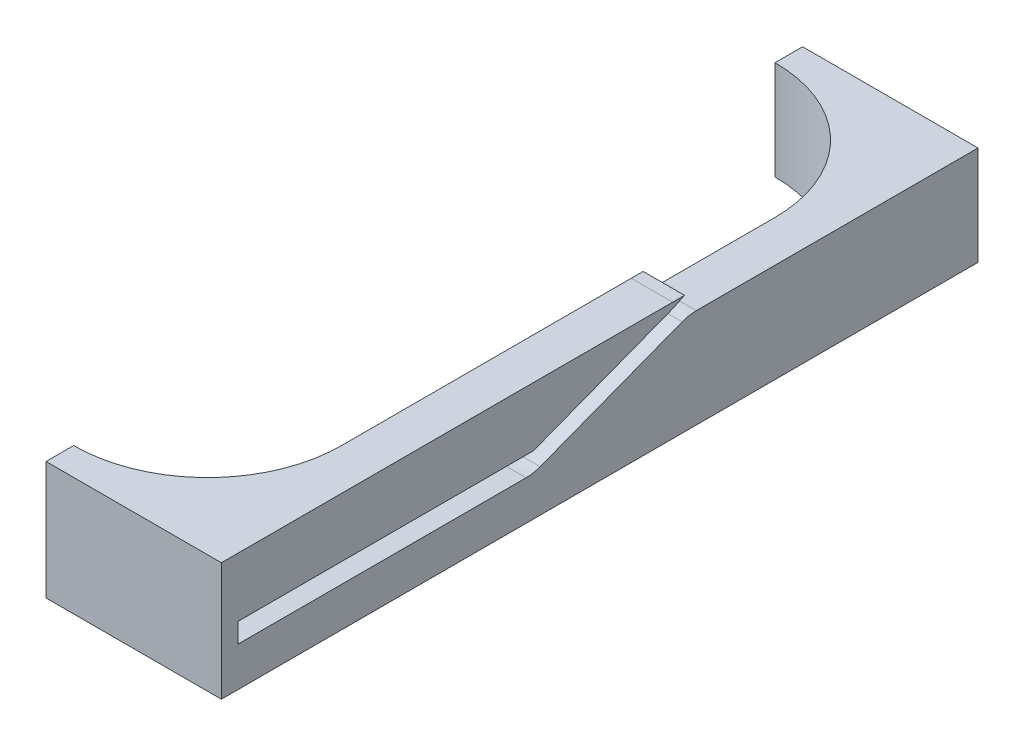
ISO-10303-21;
HEADER;
FILE_DESCRIPTION(('STEP AP214'),'2;1');
FILE_NAME('part.step','',(''),(''),'','','');
FILE_SCHEMA(('AUTOMOTIVE_DESIGN { 1 0 10303 214 1 1 1 1 }'));
ENDSEC;
DATA;
#1=APPLICATION_CONTEXT('core data for automotive mechanical design processes');
#2=APPLICATION_PROTOCOL_DEFINITION('international standard','automotive_design',2000,#1);
#3=PRODUCT_CONTEXT('',#1,'mechanical');
#4=PRODUCT('Part','Part','',(#3));
#5=PRODUCT_RELATED_PRODUCT_CATEGORY('part','',(#4));
#6=PRODUCT_DEFINITION_FORMATION('','',#4);
#7=PRODUCT_DEFINITION_CONTEXT('part definition',#1,'design');
#8=PRODUCT_DEFINITION('design','',#6,#7);
#9=PRODUCT_DEFINITION_SHAPE('','',#8);
#10=(LENGTH_UNIT() NAMED_UNIT(*) SI_UNIT(.MILLI.,.METRE.));
#11=(NAMED_UNIT(*) PLANE_ANGLE_UNIT() SI_UNIT($,.RADIAN.));
#12=(NAMED_UNIT(*) SI_UNIT($,.STERADIAN.) SOLID_ANGLE_UNIT());
#13=UNCERTAINTY_MEASURE_WITH_UNIT(LENGTH_MEASURE(1.E-05),#10,'distance_accuracy_value','');
#14=(GEOMETRIC_REPRESENTATION_CONTEXT(3) GLOBAL_UNCERTAINTY_ASSIGNED_CONTEXT((#13)) GLOBAL_UNIT_ASSIGNED_CONTEXT((#10,
#11,#12)) REPRESENTATION_CONTEXT('',''));
#15=CARTESIAN_POINT('',(0.,0.,0.));
#16=DIRECTION('',(0.,0.,1.));
#17=DIRECTION('',(1.,0.,0.));
#18=AXIS2_PLACEMENT_3D('',#15,#16,#17);
#19=CARTESIAN_POINT('',(23.5,30.,34.9563310678291));
#20=DIRECTION('',(-1.,0.,0.));
#21=DIRECTION('',(0.,0.,1.));
#22=AXIS2_PLACEMENT_3D('',#19,#20,#21);
#23=PLANE('',#22);
#24=DIRECTION('',(0.,0.,-1.));
#25=VECTOR('',#24,1.);
#26=CARTESIAN_POINT('',(23.5,30.,34.9563310678291));
#27=LINE('',#26,#25);
#28=CARTESIAN_POINT('',(23.5,30.,34.9563310678291));
#29=VERTEX_POINT('',#28);
#30=CARTESIAN_POINT('',(23.5000000000001,30.,-38.5706030067295));
#31=VERTEX_POINT('',#30);
#32=EDGE_CURVE('E289',#29,#31,#27,.T.);
#33=ORIENTED_EDGE('',*,*,#32,.T.);
#34=DIRECTION('',(0.,-0.00235800229667384,0.99999721990872));
#35=VECTOR('',#34,1.);
#36=CARTESIAN_POINT('',(23.5,30.0070740265565,-41.5706030067296));
#37=LINE('',#36,#35);
#38=CARTESIAN_POINT('',(23.5,30.0070740265565,-41.5706030067296));
#39=VERTEX_POINT('',#38);
#40=EDGE_CURVE('E249',#39,#31,#37,.T.);
#41=ORIENTED_EDGE('',*,*,#40,.F.);
#42=DIRECTION('',(0.,0.436980688966859,-0.899470887505566));
#43=VECTOR('',#42,1.);
#44=CARTESIAN_POINT('',(23.5,28.5496148857319,-38.5706030067296));
#45=LINE('',#44,#43);
#46=CARTESIAN_POINT('',(23.5000000000001,28.5496148857319,-38.5706030067295));
#47=VERTEX_POINT('',#46);
#48=EDGE_CURVE('E252',#47,#39,#45,.T.);
#49=ORIENTED_EDGE('',*,*,#48,.F.);
#50=DIRECTION('',(0.,0.357847127089134,-0.933780184858328));
#51=VECTOR('',#50,1.);
#52=CARTESIAN_POINT('',(23.5,4.16627738500398,25.0562244156447));
#53=LINE('',#52,#51);
#54=CARTESIAN_POINT('',(23.5,15.,-3.21371193517876));
#55=VERTEX_POINT('',#54);
#56=EDGE_CURVE('E242',#55,#47,#53,.T.);
#57=ORIENTED_EDGE('',*,*,#56,.F.);
#58=DIRECTION('',(0.,0.,-1.));
#59=VECTOR('',#58,1.);
#60=CARTESIAN_POINT('',(23.5,15.,34.9563310678291));
#61=LINE('',#60,#59);
#62=CARTESIAN_POINT('',(23.5,15.,34.9563310678291));
#63=VERTEX_POINT('',#62);
#64=EDGE_CURVE('E305',#63,#55,#61,.T.);
#65=ORIENTED_EDGE('',*,*,#64,.F.);
#66=DIRECTION('',(0.,-1.,0.));
#67=VECTOR('',#66,1.);
#68=CARTESIAN_POINT('',(23.5,30.,34.9563310678291));
#69=LINE('',#68,#67);
#70=EDGE_CURVE('E277',#29,#63,#69,.T.);
#71=ORIENTED_EDGE('',*,*,#70,.F.);
#72=EDGE_LOOP('',(#33,#41,#49,#57,#65,#71));
#73=FACE_BOUND('',#72,.T.);
#74=ADVANCED_FACE('F37',(#73),#23,.T.);
#75=CARTESIAN_POINT('',(-10.5,30.,34.9563310678291));
#76=DIRECTION('',(0.,-1.,0.));
#77=DIRECTION('',(0.,0.,-1.));
#78=AXIS2_PLACEMENT_3D('',#75,#76,#77);
#79=CYLINDRICAL_SURFACE('',#78,34.);
#80=DIRECTION('',(0.,-1.,0.));
#81=VECTOR('',#80,1.);
#82=CARTESIAN_POINT('',(-10.5,30.,68.9563310678291));
#83=LINE('',#82,#81);
#84=CARTESIAN_POINT('',(-10.5,30.,68.9563310678291));
#85=VERTEX_POINT('',#84);
#86=CARTESIAN_POINT('',(-10.5,15.,68.9563310678291));
#87=VERTEX_POINT('',#86);
#88=EDGE_CURVE('E350',#85,#87,#83,.T.);
#89=ORIENTED_EDGE('',*,*,#88,.F.);
#90=CARTESIAN_POINT('',(-10.5,30.,34.9563310678291));
#91=DIRECTION('',(0.,1.,0.));
#92=DIRECTION('',(0.,0.,1.));
#93=AXIS2_PLACEMENT_3D('',#90,#91,#92);
#94=CIRCLE('',#93,34.);
#95=EDGE_CURVE('E282',#85,#29,#94,.T.);
#96=ORIENTED_EDGE('',*,*,#95,.T.);
#97=ORIENTED_EDGE('',*,*,#70,.T.);
#98=CARTESIAN_POINT('',(-10.5,15.,34.9563310678291));
#99=DIRECTION('',(0.,1.,0.));
#100=DIRECTION('',(0.,0.,1.));
#101=AXIS2_PLACEMENT_3D('',#98,#99,#100);
#102=CIRCLE('',#101,34.);
#103=EDGE_CURVE('E309',#87,#63,#102,.T.);
#104=ORIENTED_EDGE('',*,*,#103,.F.);
#105=EDGE_LOOP('',(#89,#96,#97,#104));
#106=FACE_BOUND('',#105,.T.);
#107=ADVANCED_FACE('F349',(#106),#79,.F.);
#108=CARTESIAN_POINT('',(0.,30.,0.));
#109=DIRECTION('',(0.,-1.,0.));
#110=DIRECTION('',(0.,0.,-1.));
#111=AXIS2_PLACEMENT_3D('',#108,#109,#110);
#112=PLANE('',#111);
#113=ORIENTED_EDGE('',*,*,#95,.F.);
#114=DIRECTION('',(0.,0.,1.));
#115=VECTOR('',#114,1.);
#116=CARTESIAN_POINT('',(-10.5,30.,0.));
#117=LINE('',#116,#115);
#118=CARTESIAN_POINT('',(-10.5,30.,75.9563310678291));
#119=VERTEX_POINT('',#118);
#120=EDGE_CURVE('E292',#85,#119,#117,.T.);
#121=ORIENTED_EDGE('',*,*,#120,.T.);
#122=DIRECTION('',(1.,0.,0.));
#123=VECTOR('',#122,1.);
#124=CARTESIAN_POINT('',(-55.,30.,75.9563310678291));
#125=LINE('',#124,#123);
#126=CARTESIAN_POINT('',(34.,30.,75.9563310678291));
#127=VERTEX_POINT('',#126);
#128=EDGE_CURVE('E276',#119,#127,#125,.T.);
#129=ORIENTED_EDGE('',*,*,#128,.T.);
#130=DIRECTION('',(0.,0.,-1.));
#131=VECTOR('',#130,1.);
#132=CARTESIAN_POINT('',(34.,30.,75.9563310678291));
#133=LINE('',#132,#131);
#134=CARTESIAN_POINT('',(34.,30.,-38.5706030067295));
#135=VERTEX_POINT('',#134);
#136=EDGE_CURVE('E274',#127,#135,#133,.T.);
#137=ORIENTED_EDGE('',*,*,#136,.T.);
#138=DIRECTION('',(1.,0.,0.));
#139=VECTOR('',#138,1.);
#140=CARTESIAN_POINT('',(34.,30.,-38.5706030067295));
#141=LINE('',#140,#139);
#142=EDGE_CURVE('E246',#31,#135,#141,.T.);
#143=ORIENTED_EDGE('',*,*,#142,.F.);
#144=ORIENTED_EDGE('',*,*,#32,.F.);
#145=EDGE_LOOP('',(#113,#121,#129,#137,#143,#144));
#146=FACE_BOUND('',#145,.T.);
#147=ADVANCED_FACE('F341',(#146),#112,.F.);
#148=CARTESIAN_POINT('',(0.,0.,0.));
#149=DIRECTION('',(0.,-1.,0.));
#150=DIRECTION('',(0.,0.,-1.));
#151=AXIS2_PLACEMENT_3D('',#148,#149,#150);
#152=PLANE('',#151);
#153=DIRECTION('',(0.,0.,1.));
#154=VECTOR('',#153,1.);
#155=CARTESIAN_POINT('',(-10.5,0.,0.));
#156=LINE('',#155,#154);
#157=CARTESIAN_POINT('',(-10.5,0.,-116.043668932171));
#158=VERTEX_POINT('',#157);
#159=CARTESIAN_POINT('',(-10.5,0.,-109.043668932171));
#160=VERTEX_POINT('',#159);
#161=EDGE_CURVE('E364',#158,#160,#156,.T.);
#162=ORIENTED_EDGE('',*,*,#161,.F.);
#163=DIRECTION('',(-1.,0.,0.));
#164=VECTOR('',#163,1.);
#165=CARTESIAN_POINT('',(-55.,0.,-116.043668932171));
#166=LINE('',#165,#164);
#167=CARTESIAN_POINT('',(34.,0.,-116.043668932171));
#168=VERTEX_POINT('',#167);
#169=EDGE_CURVE('E186',#168,#158,#166,.T.);
#170=ORIENTED_EDGE('',*,*,#169,.F.);
#171=DIRECTION('',(0.,0.,-1.));
#172=VECTOR('',#171,1.);
#173=CARTESIAN_POINT('',(34.,0.,75.9563310678291));
#174=LINE('',#173,#172);
#175=CARTESIAN_POINT('',(34.,0.,75.9563310678291));
#176=VERTEX_POINT('',#175);
#177=EDGE_CURVE('E194',#176,#168,#174,.T.);
#178=ORIENTED_EDGE('',*,*,#177,.F.);
#179=DIRECTION('',(1.,0.,0.));
#180=VECTOR('',#179,1.);
#181=CARTESIAN_POINT('',(-55.,0.,75.9563310678291));
#182=LINE('',#181,#180);
#183=CARTESIAN_POINT('',(-10.5,0.,75.9563310678291));
#184=VERTEX_POINT('',#183);
#185=EDGE_CURVE('E234',#184,#176,#182,.T.);
#186=ORIENTED_EDGE('',*,*,#185,.F.);
#187=CARTESIAN_POINT('',(-10.5,0.,72.8382839667634));
#188=VERTEX_POINT('',#187);
#189=EDGE_CURVE('E363',#188,#184,#156,.T.);
#190=ORIENTED_EDGE('',*,*,#189,.F.);
#191=CARTESIAN_POINT('',(-10.5,0.,37.8388440271387));
#192=DIRECTION('',(0.,-1.,0.));
#193=DIRECTION('',(0.,0.,-1.));
#194=AXIS2_PLACEMENT_3D('',#191,#192,#193);
#195=CIRCLE('',#194,34.9994399396247);
#196=CARTESIAN_POINT('',(23.5,0.,29.5345802977404));
#197=VERTEX_POINT('',#196);
#198=EDGE_CURVE('E296',#197,#188,#195,.T.);
#199=ORIENTED_EDGE('',*,*,#198,.F.);
#200=DIRECTION('',(0.,0.,-1.));
#201=VECTOR('',#200,1.);
#202=CARTESIAN_POINT('',(23.5,0.,34.9563310678291));
#203=LINE('',#202,#201);
#204=CARTESIAN_POINT('',(23.5,0.,-75.0436689321709));
#205=VERTEX_POINT('',#204);
#206=EDGE_CURVE('E279',#197,#205,#203,.T.);
#207=ORIENTED_EDGE('',*,*,#206,.T.);
#208=CARTESIAN_POINT('',(-10.5,0.,-75.0436689321709));
#209=DIRECTION('',(0.,1.,0.));
#210=DIRECTION('',(0.,0.,1.));
#211=AXIS2_PLACEMENT_3D('',#208,#209,#210);
#212=CIRCLE('',#211,34.);
#213=EDGE_CURVE('E238',#205,#160,#212,.T.);
#214=ORIENTED_EDGE('',*,*,#213,.T.);
#215=EDGE_LOOP('',(#162,#170,#178,#186,#190,#199,#207,#214));
#216=FACE_BOUND('',#215,.T.);
#217=ADVANCED_FACE('F361',(#216),#152,.T.);
#218=CARTESIAN_POINT('',(-55.,30.,75.9563310678291));
#219=DIRECTION('',(0.,0.,-1.));
#220=DIRECTION('',(-1.,0.,0.));
#221=AXIS2_PLACEMENT_3D('',#218,#219,#220);
#222=PLANE('',#221);
#223=ORIENTED_EDGE('',*,*,#128,.F.);
#224=DIRECTION('',(0.,-1.,0.));
#225=VECTOR('',#224,1.);
#226=CARTESIAN_POINT('',(-10.5,30.,75.9563310678291));
#227=LINE('',#226,#225);
#228=EDGE_CURVE('E353',#119,#184,#227,.T.);
#229=ORIENTED_EDGE('',*,*,#228,.T.);
#230=ORIENTED_EDGE('',*,*,#185,.T.);
#231=DIRECTION('',(0.,-1.,0.));
#232=VECTOR('',#231,1.);
#233=CARTESIAN_POINT('',(34.,30.,75.9563310678291));
#234=LINE('',#233,#232);
#235=EDGE_CURVE('E198',#127,#176,#234,.T.);
#236=ORIENTED_EDGE('',*,*,#235,.F.);
#237=EDGE_LOOP('',(#223,#229,#230,#236));
#238=FACE_BOUND('',#237,.T.);
#239=ADVANCED_FACE('F357',(#238),#222,.F.);
#240=CARTESIAN_POINT('',(34.,30.,75.9563310678291));
#241=DIRECTION('',(-1.,0.,0.));
#242=DIRECTION('',(0.,0.,1.));
#243=AXIS2_PLACEMENT_3D('',#240,#241,#242);
#244=PLANE('',#243);
#245=DIRECTION('',(0.,0.,-1.));
#246=VECTOR('',#245,1.);
#247=CARTESIAN_POINT('',(34.,25.1387737169865,-42.7174157512916));
#248=LINE('',#247,#246);
#249=CARTESIAN_POINT('',(34.,25.1387737169865,-44.567921459702));
#250=VERTEX_POINT('',#249);
#251=CARTESIAN_POINT('',(34.,25.1387737169865,-116.043668932171));
#252=VERTEX_POINT('',#251);
#253=EDGE_CURVE('E191',#250,#252,#248,.T.);
#254=ORIENTED_EDGE('',*,*,#253,.F.);
#255=CARTESIAN_POINT('',(34.,15.1387737169865,-44.567921459702));
#256=DIRECTION('',(-1.,0.,0.));
#257=DIRECTION('',(0.,0.,1.));
#258=AXIS2_PLACEMENT_3D('',#255,#256,#257);
#259=CIRCLE('',#258,10.);
#260=CARTESIAN_POINT('',(34.,24.4765755655698,-40.9894501888107));
#261=VERTEX_POINT('',#260);
#262=EDGE_CURVE('E208',#250,#261,#259,.F.);
#263=ORIENTED_EDGE('',*,*,#262,.T.);
#264=DIRECTION('',(0.,-0.357847127089134,0.933780184858328));
#265=VECTOR('',#264,1.);
#266=CARTESIAN_POINT('',(34.,-13.8936225990231,59.1352344122193));
#267=LINE('',#266,#265);
#268=CARTESIAN_POINT('',(34.,10.6621981514167,-4.94167749765966));
#269=VERTEX_POINT('',#268);
#270=EDGE_CURVE('E226',#261,#269,#267,.T.);
#271=ORIENTED_EDGE('',*,*,#270,.T.);
#272=CARTESIAN_POINT('',(34.,20.,-1.36320622676831));
#273=DIRECTION('',(-1.,0.,0.));
#274=DIRECTION('',(0.,0.,1.));
#275=AXIS2_PLACEMENT_3D('',#272,#273,#274);
#276=CIRCLE('',#275,10.);
#277=CARTESIAN_POINT('',(34.,10.,-1.3632062267683));
#278=VERTEX_POINT('',#277);
#279=EDGE_CURVE('E233',#269,#278,#276,.T.);
#280=ORIENTED_EDGE('',*,*,#279,.T.);
#281=DIRECTION('',(0.,0.,-1.));
#282=VECTOR('',#281,1.);
#283=CARTESIAN_POINT('',(34.,10.,71.7862880648212));
#284=LINE('',#283,#282);
#285=CARTESIAN_POINT('',(34.,10.,71.7862880648212));
#286=VERTEX_POINT('',#285);
#287=EDGE_CURVE('E323',#286,#278,#284,.T.);
#288=ORIENTED_EDGE('',*,*,#287,.F.);
#289=DIRECTION('',(0.,-1.,0.));
#290=VECTOR('',#289,1.);
#291=CARTESIAN_POINT('',(34.,10.,71.7862880648212));
#292=LINE('',#291,#290);
#293=CARTESIAN_POINT('',(34.,15.,71.7862880648212));
#294=VERTEX_POINT('',#293);
#295=EDGE_CURVE('E320',#294,#286,#292,.T.);
#296=ORIENTED_EDGE('',*,*,#295,.F.);
#297=DIRECTION('',(0.,0.,1.));
#298=VECTOR('',#297,1.);
#299=CARTESIAN_POINT('',(34.,15.,71.7862880648212));
#300=LINE('',#299,#298);
#301=CARTESIAN_POINT('',(34.,15.,-3.21371193517876));
#302=VERTEX_POINT('',#301);
#303=EDGE_CURVE('E318',#302,#294,#300,.T.);
#304=ORIENTED_EDGE('',*,*,#303,.F.);
#305=DIRECTION('',(0.,0.357847127089134,-0.933780184858328));
#306=VECTOR('',#305,1.);
#307=CARTESIAN_POINT('',(34.,-9.53389543085285,60.8059871946409));
#308=LINE('',#307,#306);
#309=CARTESIAN_POINT('',(34.,28.5496148857319,-38.5706030067296));
#310=VERTEX_POINT('',#309);
#311=EDGE_CURVE('E236',#302,#310,#308,.T.);
#312=ORIENTED_EDGE('',*,*,#311,.T.);
#313=DIRECTION('',(0.,0.436980688966858,-0.899470887505565));
#314=VECTOR('',#313,1.);
#315=CARTESIAN_POINT('',(34.,28.5496148857319,-38.5706030067296));
#316=LINE('',#315,#314);
#317=CARTESIAN_POINT('',(34.,30.0070740265565,-41.5706030067296));
#318=VERTEX_POINT('',#317);
#319=EDGE_CURVE('E258',#310,#318,#316,.T.);
#320=ORIENTED_EDGE('',*,*,#319,.T.);
#321=DIRECTION('',(0.,-0.00235800229667384,0.99999721990872));
#322=VECTOR('',#321,1.);
#323=CARTESIAN_POINT('',(34.,30.0070740265565,-41.5706030067296));
#324=LINE('',#323,#322);
#325=EDGE_CURVE('E261',#318,#135,#324,.T.);
#326=ORIENTED_EDGE('',*,*,#325,.T.);
#327=ORIENTED_EDGE('',*,*,#136,.F.);
#328=ORIENTED_EDGE('',*,*,#235,.T.);
#329=ORIENTED_EDGE('',*,*,#177,.T.);
#330=DIRECTION('',(0.,-1.,0.));
#331=VECTOR('',#330,1.);
#332=CARTESIAN_POINT('',(34.,30.,-116.043668932171));
#333=LINE('',#332,#331);
#334=EDGE_CURVE('E193',#252,#168,#333,.T.);
#335=ORIENTED_EDGE('',*,*,#334,.F.);
#336=EDGE_LOOP('',(#254,#263,#271,#280,#288,#296,#304,#312,#320,#326,#327,#328,#329,#335));
#337=FACE_BOUND('',#336,.T.);
#338=ADVANCED_FACE('F225',(#337),#244,.F.);
#339=CARTESIAN_POINT('',(-55.,30.,-116.043668932171));
#340=DIRECTION('',(0.,0.,1.));
#341=DIRECTION('',(1.,0.,0.));
#342=AXIS2_PLACEMENT_3D('',#339,#340,#341);
#343=PLANE('',#342);
#344=ORIENTED_EDGE('',*,*,#169,.T.);
#345=DIRECTION('',(0.,-1.,0.));
#346=VECTOR('',#345,1.);
#347=CARTESIAN_POINT('',(-10.5,-2.5435216050087,-116.043668932171));
#348=LINE('',#347,#346);
#349=CARTESIAN_POINT('',(-10.5,25.1387737169865,-116.043668932171));
#350=VERTEX_POINT('',#349);
#351=EDGE_CURVE('E175',#350,#158,#348,.T.);
#352=ORIENTED_EDGE('',*,*,#351,.F.);
#353=DIRECTION('',(1.,0.,0.));
#354=VECTOR('',#353,1.);
#355=CARTESIAN_POINT('',(-65.0000000000001,25.1387737169865,-116.043668932171));
#356=LINE('',#355,#354);
#357=EDGE_CURVE('E183',#350,#252,#356,.T.);
#358=ORIENTED_EDGE('',*,*,#357,.T.);
#359=ORIENTED_EDGE('',*,*,#334,.T.);
#360=EDGE_LOOP('',(#344,#352,#358,#359));
#361=FACE_BOUND('',#360,.T.);
#362=ADVANCED_FACE('F182',(#361),#343,.F.);
#363=DIRECTION('',(0.,-0.357847127089134,0.933780184858328));
#364=VECTOR('',#363,1.);
#365=CARTESIAN_POINT('',(23.5,-0.193449783166284,23.3854716332231));
#366=LINE('',#365,#364);
#367=CARTESIAN_POINT('',(23.5,24.4765755655698,-40.9894501888107));
#368=VERTEX_POINT('',#367);
#369=CARTESIAN_POINT('',(23.5,10.6621981514167,-4.94167749765965));
#370=VERTEX_POINT('',#369);
#371=EDGE_CURVE('E219',#368,#370,#366,.T.);
#372=ORIENTED_EDGE('',*,*,#371,.F.);
#373=CARTESIAN_POINT('',(23.5,15.1387737169865,-44.567921459702));
#374=DIRECTION('',(-1.,0.,0.));
#375=DIRECTION('',(0.,0.,1.));
#376=AXIS2_PLACEMENT_3D('',#373,#374,#375);
#377=CIRCLE('',#376,10.);
#378=CARTESIAN_POINT('',(23.5,25.1387737169865,-44.567921459702));
#379=VERTEX_POINT('',#378);
#380=EDGE_CURVE('E45',#368,#379,#377,.T.);
#381=ORIENTED_EDGE('',*,*,#380,.T.);
#382=DIRECTION('',(0.,0.,1.));
#383=VECTOR('',#382,1.);
#384=CARTESIAN_POINT('',(23.5,25.1387737169865,34.9563310678291));
#385=LINE('',#384,#383);
#386=CARTESIAN_POINT('',(23.5,25.1387737169865,-75.0436689321709));
#387=VERTEX_POINT('',#386);
#388=EDGE_CURVE('E206',#387,#379,#385,.T.);
#389=ORIENTED_EDGE('',*,*,#388,.F.);
#390=DIRECTION('',(0.,-1.,0.));
#391=VECTOR('',#390,1.);
#392=CARTESIAN_POINT('',(23.5,30.,-75.0436689321709));
#393=LINE('',#392,#391);
#394=EDGE_CURVE('E272',#387,#205,#393,.T.);
#395=ORIENTED_EDGE('',*,*,#394,.T.);
#396=ORIENTED_EDGE('',*,*,#206,.F.);
#397=DIRECTION('',(0.,-1.,0.));
#398=VECTOR('',#397,1.);
#399=CARTESIAN_POINT('',(23.5,10.,29.5345802977404));
#400=LINE('',#399,#398);
#401=CARTESIAN_POINT('',(23.5,10.,29.5345802977404));
#402=VERTEX_POINT('',#401);
#403=EDGE_CURVE('E294',#402,#197,#400,.T.);
#404=ORIENTED_EDGE('',*,*,#403,.F.);
#405=DIRECTION('',(0.,0.,1.));
#406=VECTOR('',#405,1.);
#407=CARTESIAN_POINT('',(23.5,10.,34.9563310678291));
#408=LINE('',#407,#406);
#409=CARTESIAN_POINT('',(23.5,10.,-1.36320622676831));
#410=VERTEX_POINT('',#409);
#411=EDGE_CURVE('E304',#410,#402,#408,.T.);
#412=ORIENTED_EDGE('',*,*,#411,.F.);
#413=CARTESIAN_POINT('',(23.5,20.,-1.36320622676831));
#414=DIRECTION('',(-1.,0.,0.));
#415=DIRECTION('',(0.,0.,1.));
#416=AXIS2_PLACEMENT_3D('',#413,#414,#415);
#417=CIRCLE('',#416,10.);
#418=EDGE_CURVE('E284',#410,#370,#417,.F.);
#419=ORIENTED_EDGE('',*,*,#418,.T.);
#420=EDGE_LOOP('',(#372,#381,#389,#395,#396,#404,#412,#419));
#421=FACE_BOUND('',#420,.T.);
#422=ADVANCED_FACE('F216',(#421),#23,.T.);
#423=CARTESIAN_POINT('',(-10.5,30.,-75.0436689321709));
#424=DIRECTION('',(0.,-1.,0.));
#425=DIRECTION('',(0.,0.,-1.));
#426=AXIS2_PLACEMENT_3D('',#423,#424,#425);
#427=CYLINDRICAL_SURFACE('',#426,34.);
#428=DIRECTION('',(0.,-1.,0.));
#429=VECTOR('',#428,1.);
#430=CARTESIAN_POINT('',(-10.5,30.,-109.043668932171));
#431=LINE('',#430,#429);
#432=CARTESIAN_POINT('',(-10.5,25.1387737169865,-109.043668932171));
#433=VERTEX_POINT('',#432);
#434=EDGE_CURVE('E60',#160,#433,#431,.F.);
#435=ORIENTED_EDGE('',*,*,#434,.F.);
#436=ORIENTED_EDGE('',*,*,#213,.F.);
#437=ORIENTED_EDGE('',*,*,#394,.F.);
#438=CARTESIAN_POINT('',(-10.5,25.1387737169865,-75.0436689321709));
#439=DIRECTION('',(0.,-1.,0.));
#440=DIRECTION('',(0.,0.,-1.));
#441=AXIS2_PLACEMENT_3D('',#438,#439,#440);
#442=CIRCLE('',#441,34.);
#443=EDGE_CURVE('E202',#433,#387,#442,.T.);
#444=ORIENTED_EDGE('',*,*,#443,.F.);
#445=EDGE_LOOP('',(#435,#436,#437,#444));
#446=FACE_BOUND('',#445,.T.);
#447=ADVANCED_FACE('F404',(#446),#427,.F.);
#448=CARTESIAN_POINT('',(-10.5,10.,37.8388440271387));
#449=DIRECTION('',(0.,-1.,0.));
#450=DIRECTION('',(0.,0.,-1.));
#451=AXIS2_PLACEMENT_3D('',#448,#449,#450);
#452=CYLINDRICAL_SURFACE('',#451,34.9994399396247);
#453=ORIENTED_EDGE('',*,*,#198,.T.);
#454=DIRECTION('',(0.,-1.,0.));
#455=VECTOR('',#454,1.);
#456=CARTESIAN_POINT('',(-10.5,10.,72.8382839667634));
#457=LINE('',#456,#455);
#458=CARTESIAN_POINT('',(-10.5,10.,72.8382839667634));
#459=VERTEX_POINT('',#458);
#460=EDGE_CURVE('E370',#188,#459,#457,.F.);
#461=ORIENTED_EDGE('',*,*,#460,.T.);
#462=CARTESIAN_POINT('',(-10.5,10.,37.8388440271387));
#463=DIRECTION('',(0.,-1.,0.));
#464=DIRECTION('',(0.,0.,-1.));
#465=AXIS2_PLACEMENT_3D('',#462,#463,#464);
#466=CIRCLE('',#465,34.9994399396247);
#467=CARTESIAN_POINT('',(-1.98343734856551,10.,71.7862880648212));
#468=VERTEX_POINT('',#467);
#469=EDGE_CURVE('E299',#468,#459,#466,.T.);
#470=ORIENTED_EDGE('',*,*,#469,.F.);
#471=EDGE_CURVE('E300',#402,#468,#466,.T.);
#472=ORIENTED_EDGE('',*,*,#471,.F.);
#473=ORIENTED_EDGE('',*,*,#403,.T.);
#474=EDGE_LOOP('',(#453,#461,#470,#472,#473));
#475=FACE_BOUND('',#474,.T.);
#476=ADVANCED_FACE('F397',(#475),#452,.F.);
#477=CARTESIAN_POINT('',(-10.5,10.,37.8388440271387));
#478=DIRECTION('',(0.,-1.,0.));
#479=DIRECTION('',(0.,0.,-1.));
#480=AXIS2_PLACEMENT_3D('',#477,#478,#479);
#481=PLANE('',#480);
#482=DIRECTION('',(0.,0.,1.));
#483=VECTOR('',#482,1.);
#484=CARTESIAN_POINT('',(-10.5,10.,37.8388440271387));
#485=LINE('',#484,#483);
#486=CARTESIAN_POINT('',(-10.5,10.,71.7862880648212));
#487=VERTEX_POINT('',#486);
#488=EDGE_CURVE('E373',#487,#459,#485,.T.);
#489=ORIENTED_EDGE('',*,*,#488,.F.);
#490=DIRECTION('',(-1.,0.,0.));
#491=VECTOR('',#490,1.);
#492=CARTESIAN_POINT('',(-10.5,10.,71.7862880648212));
#493=LINE('',#492,#491);
#494=EDGE_CURVE('E245',#468,#487,#493,.T.);
#495=ORIENTED_EDGE('',*,*,#494,.F.);
#496=ORIENTED_EDGE('',*,*,#469,.T.);
#497=EDGE_LOOP('',(#489,#495,#496));
#498=FACE_BOUND('',#497,.T.);
#499=ADVANCED_FACE('F395',(#498),#481,.T.);
#500=CARTESIAN_POINT('',(-68.,15.,71.7862880648212));
#501=DIRECTION('',(0.,1.,0.));
#502=DIRECTION('',(0.,0.,1.));
#503=AXIS2_PLACEMENT_3D('',#500,#501,#502);
#504=PLANE('',#503);
#505=DIRECTION('',(1.,0.,0.));
#506=VECTOR('',#505,1.);
#507=CARTESIAN_POINT('',(-68.,15.,71.7862880648212));
#508=LINE('',#507,#506);
#509=CARTESIAN_POINT('',(-10.5,15.,71.7862880648212));
#510=VERTEX_POINT('',#509);
#511=EDGE_CURVE('E315',#510,#294,#508,.T.);
#512=ORIENTED_EDGE('',*,*,#511,.F.);
#513=DIRECTION('',(0.,0.,-1.));
#514=VECTOR('',#513,1.);
#515=CARTESIAN_POINT('',(-10.5,15.,71.7862880648212));
#516=LINE('',#515,#514);
#517=EDGE_CURVE('E52',#510,#87,#516,.T.);
#518=ORIENTED_EDGE('',*,*,#517,.T.);
#519=ORIENTED_EDGE('',*,*,#103,.T.);
#520=ORIENTED_EDGE('',*,*,#64,.T.);
#521=DIRECTION('',(1.,0.,0.));
#522=VECTOR('',#521,1.);
#523=CARTESIAN_POINT('',(-68.,15.,-3.21371193517876));
#524=LINE('',#523,#522);
#525=EDGE_CURVE('E308',#55,#302,#524,.T.);
#526=ORIENTED_EDGE('',*,*,#525,.T.);
#527=ORIENTED_EDGE('',*,*,#303,.T.);
#528=EDGE_LOOP('',(#512,#518,#519,#520,#526,#527));
#529=FACE_BOUND('',#528,.T.);
#530=ADVANCED_FACE('F387',(#529),#504,.F.);
#531=CARTESIAN_POINT('',(-68.,10.,71.7862880648212));
#532=DIRECTION('',(0.,-1.,0.));
#533=DIRECTION('',(0.,0.,-1.));
#534=AXIS2_PLACEMENT_3D('',#531,#532,#533);
#535=PLANE('',#534);
#536=ORIENTED_EDGE('',*,*,#287,.T.);
#537=DIRECTION('',(1.,0.,0.));
#538=VECTOR('',#537,1.);
#539=CARTESIAN_POINT('',(23.5,10.,-1.36320622676831));
#540=LINE('',#539,#538);
#541=EDGE_CURVE('E312',#278,#410,#540,.F.);
#542=ORIENTED_EDGE('',*,*,#541,.T.);
#543=ORIENTED_EDGE('',*,*,#411,.T.);
#544=ORIENTED_EDGE('',*,*,#471,.T.);
#545=DIRECTION('',(1.,0.,0.));
#546=VECTOR('',#545,1.);
#547=CARTESIAN_POINT('',(-68.,10.,71.7862880648212));
#548=LINE('',#547,#546);
#549=EDGE_CURVE('E303',#468,#286,#548,.T.);
#550=ORIENTED_EDGE('',*,*,#549,.T.);
#551=EDGE_LOOP('',(#536,#542,#543,#544,#550));
#552=FACE_BOUND('',#551,.T.);
#553=ADVANCED_FACE('F486',(#552),#535,.F.);
#554=CARTESIAN_POINT('',(-68.,10.,71.7862880648212));
#555=DIRECTION('',(0.,0.,1.));
#556=DIRECTION('',(1.,0.,0.));
#557=AXIS2_PLACEMENT_3D('',#554,#555,#556);
#558=PLANE('',#557);
#559=ORIENTED_EDGE('',*,*,#494,.T.);
#560=DIRECTION('',(0.,1.,0.));
#561=VECTOR('',#560,1.);
#562=CARTESIAN_POINT('',(-10.5,10.,71.7862880648212));
#563=LINE('',#562,#561);
#564=EDGE_CURVE('E366',#487,#510,#563,.T.);
#565=ORIENTED_EDGE('',*,*,#564,.T.);
#566=ORIENTED_EDGE('',*,*,#511,.T.);
#567=ORIENTED_EDGE('',*,*,#295,.T.);
#568=ORIENTED_EDGE('',*,*,#549,.F.);
#569=EDGE_LOOP('',(#559,#565,#566,#567,#568));
#570=FACE_BOUND('',#569,.T.);
#571=ADVANCED_FACE('F390',(#570),#558,.F.);
#572=CARTESIAN_POINT('',(47.,10.,-3.21371193517876));
#573=DIRECTION('',(0.,-0.933780184858328,-0.357847127089134));
#574=DIRECTION('',(0.,0.357847127089134,-0.933780184858328));
#575=AXIS2_PLACEMENT_3D('',#572,#573,#574);
#576=PLANE('',#575);
#577=ORIENTED_EDGE('',*,*,#270,.F.);
#578=DIRECTION('',(1.,0.,0.));
#579=VECTOR('',#578,1.);
#580=CARTESIAN_POINT('',(47.,24.4765755655697,-40.9894501888107));
#581=LINE('',#580,#579);
#582=EDGE_CURVE('E210',#261,#368,#581,.F.);
#583=ORIENTED_EDGE('',*,*,#582,.T.);
#584=ORIENTED_EDGE('',*,*,#371,.T.);
#585=DIRECTION('',(1.,0.,0.));
#586=VECTOR('',#585,1.);
#587=CARTESIAN_POINT('',(34.,10.6621981514167,-4.94167749765965));
#588=LINE('',#587,#586);
#589=EDGE_CURVE('E232',#370,#269,#588,.T.);
#590=ORIENTED_EDGE('',*,*,#589,.T.);
#591=EDGE_LOOP('',(#577,#583,#584,#590));
#592=FACE_BOUND('',#591,.T.);
#593=ADVANCED_FACE('F230',(#592),#576,.F.);
#594=CARTESIAN_POINT('',(47.,29.469395921808,-40.9707153476688));
#595=DIRECTION('',(0.,0.933780184858328,0.357847127089134));
#596=DIRECTION('',(0.,-0.357847127089134,0.933780184858328));
#597=AXIS2_PLACEMENT_3D('',#594,#595,#596);
#598=PLANE('',#597);
#599=ORIENTED_EDGE('',*,*,#56,.T.);
#600=DIRECTION('',(1.,0.,0.));
#601=VECTOR('',#600,1.);
#602=CARTESIAN_POINT('',(47.,28.5496148857319,-38.5706030067295));
#603=LINE('',#602,#601);
#604=EDGE_CURVE('E257',#47,#310,#603,.T.);
#605=ORIENTED_EDGE('',*,*,#604,.T.);
#606=ORIENTED_EDGE('',*,*,#311,.F.);
#607=ORIENTED_EDGE('',*,*,#525,.F.);
#608=EDGE_LOOP('',(#599,#605,#606,#607));
#609=FACE_BOUND('',#608,.T.);
#610=ADVANCED_FACE('F384',(#609),#598,.F.);
#611=CARTESIAN_POINT('',(20.1647058379847,28.5496148857319,-38.5706030067296));
#612=DIRECTION('',(0.,-0.899470887505566,-0.436980688966859));
#613=DIRECTION('',(0.,0.436980688966859,-0.899470887505566));
#614=AXIS2_PLACEMENT_3D('',#611,#612,#613);
#615=PLANE('',#614);
#616=ORIENTED_EDGE('',*,*,#604,.F.);
#617=ORIENTED_EDGE('',*,*,#48,.T.);
#618=DIRECTION('',(1.,0.,0.));
#619=VECTOR('',#618,1.);
#620=CARTESIAN_POINT('',(20.1647058379847,30.0070740265565,-41.5706030067296));
#621=LINE('',#620,#619);
#622=EDGE_CURVE('E250',#39,#318,#621,.T.);
#623=ORIENTED_EDGE('',*,*,#622,.T.);
#624=ORIENTED_EDGE('',*,*,#319,.F.);
#625=EDGE_LOOP('',(#616,#617,#623,#624));
#626=FACE_BOUND('',#625,.T.);
#627=ADVANCED_FACE('F333',(#626),#615,.T.);
#628=CARTESIAN_POINT('',(20.1647058379847,30.0070740265565,-41.5706030067296));
#629=DIRECTION('',(0.,0.99999721990872,0.00235800229667384));
#630=DIRECTION('',(0.,-0.00235800229667384,0.99999721990872));
#631=AXIS2_PLACEMENT_3D('',#628,#629,#630);
#632=PLANE('',#631);
#633=ORIENTED_EDGE('',*,*,#622,.F.);
#634=ORIENTED_EDGE('',*,*,#40,.T.);
#635=ORIENTED_EDGE('',*,*,#142,.T.);
#636=ORIENTED_EDGE('',*,*,#325,.F.);
#637=EDGE_LOOP('',(#633,#634,#635,#636));
#638=FACE_BOUND('',#637,.T.);
#639=ADVANCED_FACE('F337',(#638),#632,.T.);
#640=CARTESIAN_POINT('',(47.,20.,-1.36320622676831));
#641=DIRECTION('',(-1.,0.,0.));
#642=DIRECTION('',(0.,0.,1.));
#643=AXIS2_PLACEMENT_3D('',#640,#641,#642);
#644=CYLINDRICAL_SURFACE('',#643,10.);
#645=ORIENTED_EDGE('',*,*,#418,.F.);
#646=ORIENTED_EDGE('',*,*,#541,.F.);
#647=ORIENTED_EDGE('',*,*,#279,.F.);
#648=ORIENTED_EDGE('',*,*,#589,.F.);
#649=EDGE_LOOP('',(#645,#646,#647,#648));
#650=FACE_BOUND('',#649,.T.);
#651=ADVANCED_FACE('F432',(#650),#644,.F.);
#652=CARTESIAN_POINT('',(-65.0000000000001,25.1387737169865,-42.7174157512916));
#653=DIRECTION('',(0.,-1.,0.));
#654=DIRECTION('',(0.,0.,-1.));
#655=AXIS2_PLACEMENT_3D('',#652,#653,#654);
#656=PLANE('',#655);
#657=ORIENTED_EDGE('',*,*,#357,.F.);
#658=DIRECTION('',(0.,0.,1.));
#659=VECTOR('',#658,1.);
#660=CARTESIAN_POINT('',(-10.5,25.1387737169865,-42.7174157512916));
#661=LINE('',#660,#659);
#662=EDGE_CURVE('E11',#350,#433,#661,.T.);
#663=ORIENTED_EDGE('',*,*,#662,.T.);
#664=ORIENTED_EDGE('',*,*,#443,.T.);
#665=ORIENTED_EDGE('',*,*,#388,.T.);
#666=DIRECTION('',(1.,0.,0.));
#667=VECTOR('',#666,1.);
#668=CARTESIAN_POINT('',(-65.0000000000001,25.1387737169865,-44.567921459702));
#669=LINE('',#668,#667);
#670=EDGE_CURVE('E205',#379,#250,#669,.T.);
#671=ORIENTED_EDGE('',*,*,#670,.T.);
#672=ORIENTED_EDGE('',*,*,#253,.T.);
#673=EDGE_LOOP('',(#657,#663,#664,#665,#671,#672));
#674=FACE_BOUND('',#673,.T.);
#675=ADVANCED_FACE('F188',(#674),#656,.F.);
#676=CARTESIAN_POINT('',(-65.0000000000001,15.1387737169865,-44.567921459702));
#677=DIRECTION('',(1.,0.,0.));
#678=DIRECTION('',(0.,0.,-1.));
#679=AXIS2_PLACEMENT_3D('',#676,#677,#678);
#680=CYLINDRICAL_SURFACE('',#679,10.);
#681=ORIENTED_EDGE('',*,*,#380,.F.);
#682=ORIENTED_EDGE('',*,*,#582,.F.);
#683=ORIENTED_EDGE('',*,*,#262,.F.);
#684=ORIENTED_EDGE('',*,*,#670,.F.);
#685=EDGE_LOOP('',(#681,#682,#683,#684));
#686=FACE_BOUND('',#685,.T.);
#687=ADVANCED_FACE('F39',(#686),#680,.T.);
#688=CARTESIAN_POINT('',(-10.5,-2.5435216050087,104.956331067829));
#689=DIRECTION('',(1.,0.,0.));
#690=DIRECTION('',(0.,0.,-1.));
#691=AXIS2_PLACEMENT_3D('',#688,#689,#690);
#692=PLANE('',#691);
#693=ORIENTED_EDGE('',*,*,#161,.T.);
#694=ORIENTED_EDGE('',*,*,#434,.T.);
#695=ORIENTED_EDGE('',*,*,#662,.F.);
#696=ORIENTED_EDGE('',*,*,#351,.T.);
#697=EDGE_LOOP('',(#693,#694,#695,#696));
#698=FACE_BOUND('',#697,.T.);
#699=ADVANCED_FACE('F174',(#698),#692,.F.);
#700=ORIENTED_EDGE('',*,*,#88,.T.);
#701=ORIENTED_EDGE('',*,*,#517,.F.);
#702=ORIENTED_EDGE('',*,*,#564,.F.);
#703=ORIENTED_EDGE('',*,*,#488,.T.);
#704=ORIENTED_EDGE('',*,*,#460,.F.);
#705=ORIENTED_EDGE('',*,*,#189,.T.);
#706=ORIENTED_EDGE('',*,*,#228,.F.);
#707=ORIENTED_EDGE('',*,*,#120,.F.);
#708=EDGE_LOOP('',(#700,#701,#702,#703,#704,#705,#706,#707));
#709=FACE_BOUND('',#708,.T.);
#710=ADVANCED_FACE('F393',(#709),#692,.F.);
#711=CLOSED_SHELL('',(#74,#107,#147,#217,#239,#338,#362,#422,#447,#476,#499,#530,#553,#571,#593,
#610,#627,#639,#651,#675,#687,#699,#710));
#712=MANIFOLD_SOLID_BREP('B2',#711);
#713=ADVANCED_BREP_SHAPE_REPRESENTATION('',(#18,#712),#14);
#714=SHAPE_DEFINITION_REPRESENTATION(#9,#713);
ENDSEC;
END-ISO-10303-21;
